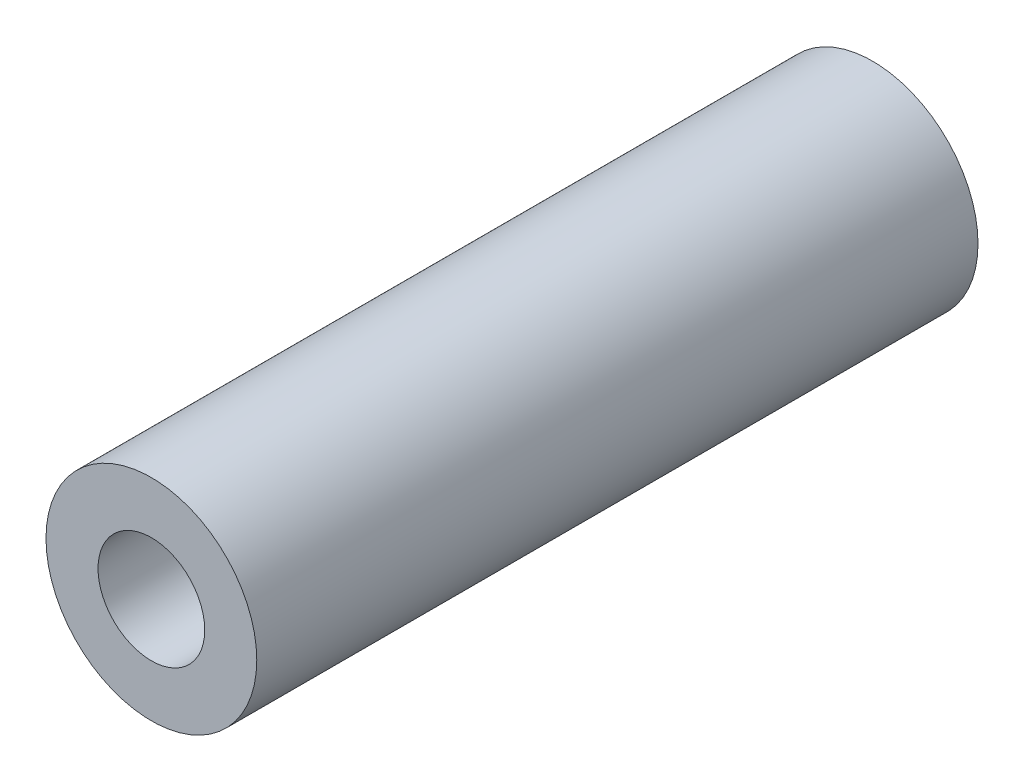
ISO-10303-21;
HEADER;
FILE_DESCRIPTION(('STEP AP214'),'2;1');
FILE_NAME('part.step','',(''),(''),'','','');
FILE_SCHEMA(('AUTOMOTIVE_DESIGN { 1 0 10303 214 1 1 1 1 }'));
ENDSEC;
DATA;
#1=APPLICATION_CONTEXT('core data for automotive mechanical design processes');
#2=APPLICATION_PROTOCOL_DEFINITION('international standard','automotive_design',2000,#1);
#3=PRODUCT_CONTEXT('',#1,'mechanical');
#4=PRODUCT('Part','Part','',(#3));
#5=PRODUCT_RELATED_PRODUCT_CATEGORY('part','',(#4));
#6=PRODUCT_DEFINITION_FORMATION('','',#4);
#7=PRODUCT_DEFINITION_CONTEXT('part definition',#1,'design');
#8=PRODUCT_DEFINITION('design','',#6,#7);
#9=PRODUCT_DEFINITION_SHAPE('','',#8);
#10=(LENGTH_UNIT() NAMED_UNIT(*) SI_UNIT(.MILLI.,.METRE.));
#11=(NAMED_UNIT(*) PLANE_ANGLE_UNIT() SI_UNIT($,.RADIAN.));
#12=(NAMED_UNIT(*) SI_UNIT($,.STERADIAN.) SOLID_ANGLE_UNIT());
#13=UNCERTAINTY_MEASURE_WITH_UNIT(LENGTH_MEASURE(1.E-05),#10,'distance_accuracy_value','');
#14=(GEOMETRIC_REPRESENTATION_CONTEXT(3) GLOBAL_UNCERTAINTY_ASSIGNED_CONTEXT((#13)) GLOBAL_UNIT_ASSIGNED_CONTEXT((#10,
#11,#12)) REPRESENTATION_CONTEXT('',''));
#15=CARTESIAN_POINT('',(0.,0.,0.));
#16=DIRECTION('',(0.,0.,1.));
#17=DIRECTION('',(1.,0.,0.));
#18=AXIS2_PLACEMENT_3D('',#15,#16,#17);
#19=CARTESIAN_POINT('',(0.,0.,53.25));
#20=DIRECTION('',(0.,0.,-1.));
#21=DIRECTION('',(-1.,0.,0.));
#22=AXIS2_PLACEMENT_3D('',#19,#20,#21);
#23=CYLINDRICAL_SURFACE('',#22,8.);
#24=CARTESIAN_POINT('',(0.,0.,53.25));
#25=DIRECTION('',(0.,0.,1.));
#26=DIRECTION('',(1.,0.,0.));
#27=AXIS2_PLACEMENT_3D('',#24,#25,#26);
#28=CIRCLE('',#27,8.);
#29=CARTESIAN_POINT('',(8.,0.,53.25));
#30=VERTEX_POINT('',#29);
#31=EDGE_CURVE('E10',#30,#30,#28,.T.);
#32=ORIENTED_EDGE('',*,*,#31,.F.);
#33=EDGE_LOOP('',(#32));
#34=FACE_BOUND('',#33,.T.);
#35=CARTESIAN_POINT('',(0.,0.,-1.5));
#36=DIRECTION('',(0.,0.,1.));
#37=DIRECTION('',(1.,0.,0.));
#38=AXIS2_PLACEMENT_3D('',#35,#36,#37);
#39=CIRCLE('',#38,8.);
#40=CARTESIAN_POINT('',(8.,0.,-1.5));
#41=VERTEX_POINT('',#40);
#42=EDGE_CURVE('E42',#41,#41,#39,.T.);
#43=ORIENTED_EDGE('',*,*,#42,.T.);
#44=EDGE_LOOP('',(#43));
#45=FACE_BOUND('',#44,.T.);
#46=ADVANCED_FACE('F40',(#34,#45),#23,.T.);
#47=CARTESIAN_POINT('',(0.,0.,53.25));
#48=DIRECTION('',(0.,0.,1.));
#49=DIRECTION('',(1.,0.,0.));
#50=AXIS2_PLACEMENT_3D('',#47,#48,#49);
#51=PLANE('',#50);
#52=CARTESIAN_POINT('',(0.,0.,53.25));
#53=DIRECTION('',(0.,0.,1.));
#54=DIRECTION('',(1.,0.,0.));
#55=AXIS2_PLACEMENT_3D('',#52,#53,#54);
#56=CIRCLE('',#55,4.05);
#57=CARTESIAN_POINT('',(4.05,0.,53.25));
#58=VERTEX_POINT('',#57);
#59=EDGE_CURVE('E37',#58,#58,#56,.F.);
#60=ORIENTED_EDGE('',*,*,#59,.T.);
#61=EDGE_LOOP('',(#60));
#62=FACE_BOUND('',#61,.T.);
#63=ORIENTED_EDGE('',*,*,#31,.T.);
#64=EDGE_LOOP('',(#63));
#65=FACE_BOUND('',#64,.T.);
#66=ADVANCED_FACE('F81',(#62,#65),#51,.T.);
#67=CARTESIAN_POINT('',(0.,0.,-1.5));
#68=DIRECTION('',(0.,0.,1.));
#69=DIRECTION('',(1.,0.,0.));
#70=AXIS2_PLACEMENT_3D('',#67,#68,#69);
#71=PLANE('',#70);
#72=CARTESIAN_POINT('',(0.,0.,-1.5));
#73=DIRECTION('',(0.,0.,1.));
#74=DIRECTION('',(1.,0.,0.));
#75=AXIS2_PLACEMENT_3D('',#72,#73,#74);
#76=CIRCLE('',#75,4.05);
#77=CARTESIAN_POINT('',(4.05,0.,-1.5));
#78=VERTEX_POINT('',#77);
#79=EDGE_CURVE('E47',#78,#78,#76,.F.);
#80=ORIENTED_EDGE('',*,*,#79,.F.);
#81=EDGE_LOOP('',(#80));
#82=FACE_BOUND('',#81,.T.);
#83=ORIENTED_EDGE('',*,*,#42,.F.);
#84=EDGE_LOOP('',(#83));
#85=FACE_BOUND('',#84,.T.);
#86=ADVANCED_FACE('F89',(#82,#85),#71,.F.);
#87=CARTESIAN_POINT('',(0.,0.,12.75));
#88=DIRECTION('',(0.,0.,-1.));
#89=DIRECTION('',(-1.,0.,0.));
#90=AXIS2_PLACEMENT_3D('',#87,#88,#89);
#91=CYLINDRICAL_SURFACE('',#90,4.05);
#92=CARTESIAN_POINT('',(0.,0.,12.75));
#93=DIRECTION('',(0.,0.,1.));
#94=DIRECTION('',(1.,0.,0.));
#95=AXIS2_PLACEMENT_3D('',#92,#93,#94);
#96=CIRCLE('',#95,4.05);
#97=CARTESIAN_POINT('',(4.05,0.,12.75));
#98=VERTEX_POINT('',#97);
#99=EDGE_CURVE('E55',#98,#98,#96,.T.);
#100=ORIENTED_EDGE('',*,*,#99,.T.);
#101=EDGE_LOOP('',(#100));
#102=FACE_BOUND('',#101,.T.);
#103=ORIENTED_EDGE('',*,*,#79,.T.);
#104=EDGE_LOOP('',(#103));
#105=FACE_BOUND('',#104,.T.);
#106=ADVANCED_FACE('F78',(#102,#105),#91,.F.);
#107=CARTESIAN_POINT('',(0.,0.,12.75));
#108=DIRECTION('',(0.,0.,1.));
#109=DIRECTION('',(1.,0.,0.));
#110=AXIS2_PLACEMENT_3D('',#107,#108,#109);
#111=PLANE('',#110);
#112=ORIENTED_EDGE('',*,*,#99,.F.);
#113=EDGE_LOOP('',(#112));
#114=FACE_BOUND('',#113,.T.);
#115=ADVANCED_FACE('F74',(#114),#111,.F.);
#116=CARTESIAN_POINT('',(0.,0.,53.35));
#117=DIRECTION('',(0.,0.,-1.));
#118=DIRECTION('',(-1.,0.,0.));
#119=AXIS2_PLACEMENT_3D('',#116,#117,#118);
#120=CYLINDRICAL_SURFACE('',#119,4.05);
#121=ORIENTED_EDGE('',*,*,#59,.F.);
#122=EDGE_LOOP('',(#121));
#123=FACE_BOUND('',#122,.T.);
#124=CARTESIAN_POINT('',(0.,0.,39.));
#125=DIRECTION('',(0.,0.,1.));
#126=DIRECTION('',(1.,0.,0.));
#127=AXIS2_PLACEMENT_3D('',#124,#125,#126);
#128=CIRCLE('',#127,4.05);
#129=CARTESIAN_POINT('',(4.05,0.,39.));
#130=VERTEX_POINT('',#129);
#131=EDGE_CURVE('E62',#130,#130,#128,.T.);
#132=ORIENTED_EDGE('',*,*,#131,.F.);
#133=EDGE_LOOP('',(#132));
#134=FACE_BOUND('',#133,.T.);
#135=ADVANCED_FACE('F69',(#123,#134),#120,.F.);
#136=CARTESIAN_POINT('',(0.,0.,39.));
#137=DIRECTION('',(0.,0.,1.));
#138=DIRECTION('',(1.,0.,0.));
#139=AXIS2_PLACEMENT_3D('',#136,#137,#138);
#140=PLANE('',#139);
#141=ORIENTED_EDGE('',*,*,#131,.T.);
#142=EDGE_LOOP('',(#141));
#143=FACE_BOUND('',#142,.T.);
#144=ADVANCED_FACE('F70',(#143),#140,.T.);
#145=CLOSED_SHELL('',(#46,#66,#86,#106,#115,#135,#144));
#146=MANIFOLD_SOLID_BREP('B2',#145);
#147=ADVANCED_BREP_SHAPE_REPRESENTATION('',(#18,#146),#14);
#148=SHAPE_DEFINITION_REPRESENTATION(#9,#147);
ENDSEC;
END-ISO-10303-21;
